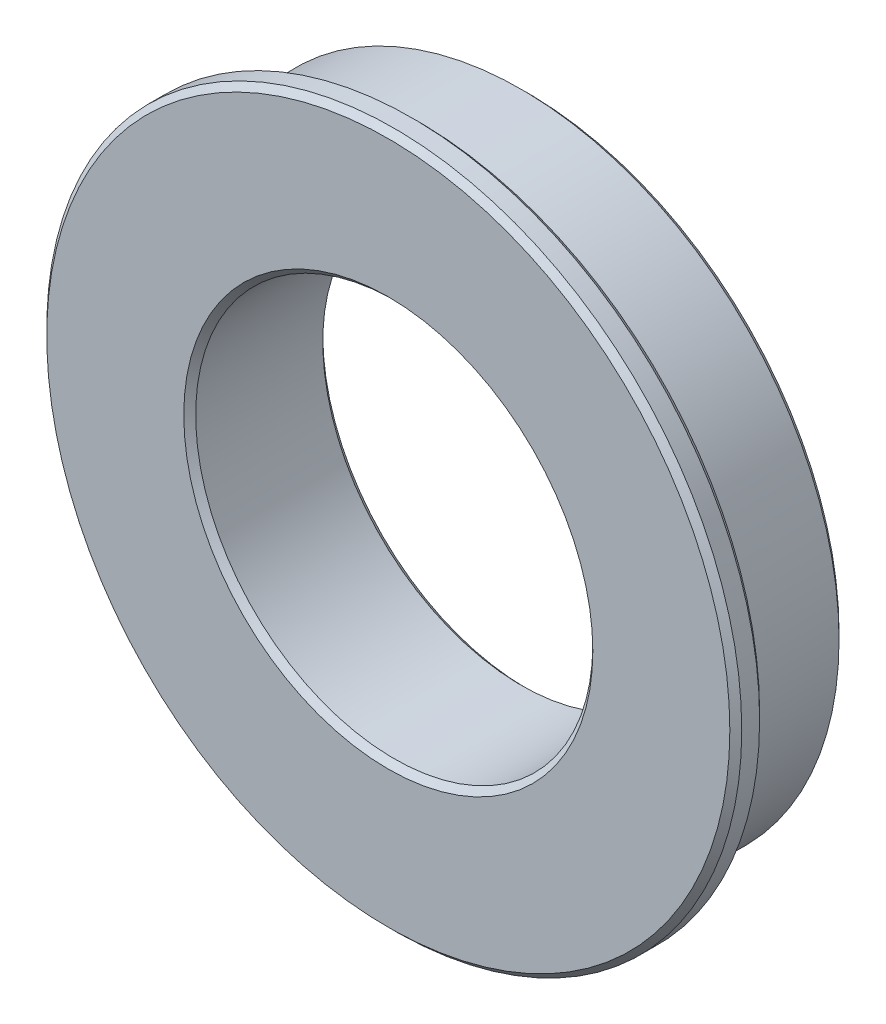
ISO-10303-21;
HEADER;
FILE_DESCRIPTION(('STEP AP214'),'2;1');
FILE_NAME('part.step','',(''),(''),'','','');
FILE_SCHEMA(('AUTOMOTIVE_DESIGN { 1 0 10303 214 1 1 1 1 }'));
ENDSEC;
DATA;
#1=APPLICATION_CONTEXT('core data for automotive mechanical design processes');
#2=APPLICATION_PROTOCOL_DEFINITION('international standard','automotive_design',2000,#1);
#3=PRODUCT_CONTEXT('',#1,'mechanical');
#4=PRODUCT('Part','Part','',(#3));
#5=PRODUCT_RELATED_PRODUCT_CATEGORY('part','',(#4));
#6=PRODUCT_DEFINITION_FORMATION('','',#4);
#7=PRODUCT_DEFINITION_CONTEXT('part definition',#1,'design');
#8=PRODUCT_DEFINITION('design','',#6,#7);
#9=PRODUCT_DEFINITION_SHAPE('','',#8);
#10=(LENGTH_UNIT() NAMED_UNIT(*) SI_UNIT(.MILLI.,.METRE.));
#11=(NAMED_UNIT(*) PLANE_ANGLE_UNIT() SI_UNIT($,.RADIAN.));
#12=(NAMED_UNIT(*) SI_UNIT($,.STERADIAN.) SOLID_ANGLE_UNIT());
#13=UNCERTAINTY_MEASURE_WITH_UNIT(LENGTH_MEASURE(1.E-05),#10,'distance_accuracy_value','');
#14=(GEOMETRIC_REPRESENTATION_CONTEXT(3) GLOBAL_UNCERTAINTY_ASSIGNED_CONTEXT((#13)) GLOBAL_UNIT_ASSIGNED_CONTEXT((#10,
#11,#12)) REPRESENTATION_CONTEXT('',''));
#15=CARTESIAN_POINT('',(0.,0.,0.));
#16=DIRECTION('',(0.,0.,1.));
#17=DIRECTION('',(1.,0.,0.));
#18=AXIS2_PLACEMENT_3D('',#15,#16,#17);
#19=CARTESIAN_POINT('',(0.,0.,3.5));
#20=DIRECTION('',(0.,0.,-1.));
#21=DIRECTION('',(-1.,0.,0.));
#22=AXIS2_PLACEMENT_3D('',#19,#20,#21);
#23=CYLINDRICAL_SURFACE('',#22,16.);
#24=CARTESIAN_POINT('',(0.,0.,-3.2));
#25=DIRECTION('',(0.,0.,1.));
#26=DIRECTION('',(1.,0.,0.));
#27=AXIS2_PLACEMENT_3D('',#24,#25,#26);
#28=CIRCLE('',#27,16.);
#29=CARTESIAN_POINT('',(16.,0.,-3.2));
#30=VERTEX_POINT('',#29);
#31=EDGE_CURVE('E10',#30,#30,#28,.T.);
#32=ORIENTED_EDGE('',*,*,#31,.T.);
#33=EDGE_LOOP('',(#32));
#34=FACE_BOUND('',#33,.T.);
#35=CARTESIAN_POINT('',(0.,0.,2.));
#36=DIRECTION('',(0.,0.,1.));
#37=DIRECTION('',(1.,0.,0.));
#38=AXIS2_PLACEMENT_3D('',#35,#36,#37);
#39=CIRCLE('',#38,16.);
#40=CARTESIAN_POINT('',(16.,0.,2.));
#41=VERTEX_POINT('',#40);
#42=EDGE_CURVE('E72',#41,#41,#39,.T.);
#43=ORIENTED_EDGE('',*,*,#42,.F.);
#44=EDGE_LOOP('',(#43));
#45=FACE_BOUND('',#44,.T.);
#46=ADVANCED_FACE('F33',(#34,#45),#23,.T.);
#47=CARTESIAN_POINT('',(0.,0.,3.5));
#48=DIRECTION('',(0.,0.,1.));
#49=DIRECTION('',(1.,0.,0.));
#50=AXIS2_PLACEMENT_3D('',#47,#48,#49);
#51=PLANE('',#50);
#52=CARTESIAN_POINT('',(0.,0.,3.5));
#53=DIRECTION('',(0.,0.,1.));
#54=DIRECTION('',(1.,0.,0.));
#55=AXIS2_PLACEMENT_3D('',#52,#53,#54);
#56=CIRCLE('',#55,10.3);
#57=CARTESIAN_POINT('',(10.3,0.,3.5));
#58=VERTEX_POINT('',#57);
#59=EDGE_CURVE('E60',#58,#58,#56,.F.);
#60=ORIENTED_EDGE('',*,*,#59,.T.);
#61=EDGE_LOOP('',(#60));
#62=FACE_BOUND('',#61,.T.);
#63=CARTESIAN_POINT('',(0.,0.,3.5));
#64=DIRECTION('',(0.,0.,1.));
#65=DIRECTION('',(1.,0.,0.));
#66=AXIS2_PLACEMENT_3D('',#63,#64,#65);
#67=CIRCLE('',#66,17.2);
#68=CARTESIAN_POINT('',(17.2,0.,3.5));
#69=VERTEX_POINT('',#68);
#70=EDGE_CURVE('E63',#69,#69,#67,.T.);
#71=ORIENTED_EDGE('',*,*,#70,.T.);
#72=EDGE_LOOP('',(#71));
#73=FACE_BOUND('',#72,.T.);
#74=ADVANCED_FACE('F79',(#62,#73),#51,.T.);
#75=CARTESIAN_POINT('',(0.,0.,-3.5));
#76=DIRECTION('',(0.,0.,1.));
#77=DIRECTION('',(1.,0.,0.));
#78=AXIS2_PLACEMENT_3D('',#75,#76,#77);
#79=PLANE('',#78);
#80=CARTESIAN_POINT('',(0.,0.,-3.5));
#81=DIRECTION('',(0.,0.,1.));
#82=DIRECTION('',(1.,0.,0.));
#83=AXIS2_PLACEMENT_3D('',#80,#81,#82);
#84=CIRCLE('',#83,10.3);
#85=CARTESIAN_POINT('',(10.3,0.,-3.5));
#86=VERTEX_POINT('',#85);
#87=EDGE_CURVE('E41',#86,#86,#84,.T.);
#88=ORIENTED_EDGE('',*,*,#87,.T.);
#89=EDGE_LOOP('',(#88));
#90=FACE_BOUND('',#89,.T.);
#91=CARTESIAN_POINT('',(0.,0.,-3.5));
#92=DIRECTION('',(0.,0.,1.));
#93=DIRECTION('',(1.,0.,0.));
#94=AXIS2_PLACEMENT_3D('',#91,#92,#93);
#95=CIRCLE('',#94,15.7);
#96=CARTESIAN_POINT('',(15.7,0.,-3.5));
#97=VERTEX_POINT('',#96);
#98=EDGE_CURVE('E45',#97,#97,#95,.F.);
#99=ORIENTED_EDGE('',*,*,#98,.T.);
#100=EDGE_LOOP('',(#99));
#101=FACE_BOUND('',#100,.T.);
#102=ADVANCED_FACE('F84',(#90,#101),#79,.F.);
#103=CARTESIAN_POINT('',(0.,0.,3.5));
#104=DIRECTION('',(0.,0.,-1.));
#105=DIRECTION('',(-1.,0.,0.));
#106=AXIS2_PLACEMENT_3D('',#103,#104,#105);
#107=CYLINDRICAL_SURFACE('',#106,10.);
#108=CARTESIAN_POINT('',(0.,0.,3.2));
#109=DIRECTION('',(0.,0.,1.));
#110=DIRECTION('',(1.,0.,0.));
#111=AXIS2_PLACEMENT_3D('',#108,#109,#110);
#112=CIRCLE('',#111,10.);
#113=CARTESIAN_POINT('',(10.,0.,3.2));
#114=VERTEX_POINT('',#113);
#115=EDGE_CURVE('E66',#114,#114,#112,.T.);
#116=ORIENTED_EDGE('',*,*,#115,.T.);
#117=EDGE_LOOP('',(#116));
#118=FACE_BOUND('',#117,.T.);
#119=CARTESIAN_POINT('',(0.,0.,-3.2));
#120=DIRECTION('',(0.,0.,1.));
#121=DIRECTION('',(1.,0.,0.));
#122=AXIS2_PLACEMENT_3D('',#119,#120,#121);
#123=CIRCLE('',#122,10.);
#124=CARTESIAN_POINT('',(10.,0.,-3.2));
#125=VERTEX_POINT('',#124);
#126=EDGE_CURVE('E69',#125,#125,#123,.F.);
#127=ORIENTED_EDGE('',*,*,#126,.T.);
#128=EDGE_LOOP('',(#127));
#129=FACE_BOUND('',#128,.T.);
#130=ADVANCED_FACE('F123',(#118,#129),#107,.F.);
#131=CARTESIAN_POINT('',(0.,0.,2.));
#132=DIRECTION('',(0.,0.,1.));
#133=DIRECTION('',(1.,0.,0.));
#134=AXIS2_PLACEMENT_3D('',#131,#132,#133);
#135=PLANE('',#134);
#136=CARTESIAN_POINT('',(0.,0.,2.));
#137=DIRECTION('',(0.,0.,1.));
#138=DIRECTION('',(1.,0.,0.));
#139=AXIS2_PLACEMENT_3D('',#136,#137,#138);
#140=CIRCLE('',#139,17.2);
#141=CARTESIAN_POINT('',(17.2,0.,2.));
#142=VERTEX_POINT('',#141);
#143=EDGE_CURVE('E49',#142,#142,#140,.F.);
#144=ORIENTED_EDGE('',*,*,#143,.T.);
#145=EDGE_LOOP('',(#144));
#146=FACE_BOUND('',#145,.T.);
#147=ORIENTED_EDGE('',*,*,#42,.T.);
#148=EDGE_LOOP('',(#147));
#149=FACE_BOUND('',#148,.T.);
#150=ADVANCED_FACE('F76',(#146,#149),#135,.F.);
#151=CARTESIAN_POINT('',(0.,0.,2.));
#152=DIRECTION('',(0.,0.,1.));
#153=DIRECTION('',(1.,0.,0.));
#154=AXIS2_PLACEMENT_3D('',#151,#152,#153);
#155=CYLINDRICAL_SURFACE('',#154,17.5);
#156=CARTESIAN_POINT('',(0.,0.,3.2));
#157=DIRECTION('',(0.,0.,1.));
#158=DIRECTION('',(1.,0.,0.));
#159=AXIS2_PLACEMENT_3D('',#156,#157,#158);
#160=CIRCLE('',#159,17.5);
#161=CARTESIAN_POINT('',(17.5,0.,3.2));
#162=VERTEX_POINT('',#161);
#163=EDGE_CURVE('E54',#162,#162,#160,.F.);
#164=ORIENTED_EDGE('',*,*,#163,.T.);
#165=EDGE_LOOP('',(#164));
#166=FACE_BOUND('',#165,.T.);
#167=CARTESIAN_POINT('',(0.,0.,2.3));
#168=DIRECTION('',(0.,0.,1.));
#169=DIRECTION('',(1.,0.,0.));
#170=AXIS2_PLACEMENT_3D('',#167,#168,#169);
#171=CIRCLE('',#170,17.5);
#172=CARTESIAN_POINT('',(17.5,0.,2.3));
#173=VERTEX_POINT('',#172);
#174=EDGE_CURVE('E57',#173,#173,#171,.T.);
#175=ORIENTED_EDGE('',*,*,#174,.T.);
#176=EDGE_LOOP('',(#175));
#177=FACE_BOUND('',#176,.T.);
#178=ADVANCED_FACE('F97',(#166,#177),#155,.T.);
#179=CARTESIAN_POINT('',(0.,0.,3.2));
#180=DIRECTION('',(0.,0.,1.));
#181=DIRECTION('',(1.,0.,0.));
#182=AXIS2_PLACEMENT_3D('',#179,#180,#181);
#183=CONICAL_SURFACE('',#182,10.,0.785398163397448);
#184=ORIENTED_EDGE('',*,*,#59,.F.);
#185=EDGE_LOOP('',(#184));
#186=FACE_BOUND('',#185,.T.);
#187=ORIENTED_EDGE('',*,*,#115,.F.);
#188=EDGE_LOOP('',(#187));
#189=FACE_BOUND('',#188,.T.);
#190=ADVANCED_FACE('F90',(#186,#189),#183,.F.);
#191=CARTESIAN_POINT('',(0.,0.,3.5));
#192=DIRECTION('',(0.,0.,-1.));
#193=DIRECTION('',(-1.,0.,0.));
#194=AXIS2_PLACEMENT_3D('',#191,#192,#193);
#195=CONICAL_SURFACE('',#194,17.2,0.785398163397443);
#196=ORIENTED_EDGE('',*,*,#163,.F.);
#197=EDGE_LOOP('',(#196));
#198=FACE_BOUND('',#197,.T.);
#199=ORIENTED_EDGE('',*,*,#70,.F.);
#200=EDGE_LOOP('',(#199));
#201=FACE_BOUND('',#200,.T.);
#202=ADVANCED_FACE('F96',(#198,#201),#195,.T.);
#203=CARTESIAN_POINT('',(0.,0.,2.3));
#204=DIRECTION('',(0.,0.,1.));
#205=DIRECTION('',(1.,0.,0.));
#206=AXIS2_PLACEMENT_3D('',#203,#204,#205);
#207=CONICAL_SURFACE('',#206,17.5,0.785398163397454);
#208=ORIENTED_EDGE('',*,*,#143,.F.);
#209=EDGE_LOOP('',(#208));
#210=FACE_BOUND('',#209,.T.);
#211=ORIENTED_EDGE('',*,*,#174,.F.);
#212=EDGE_LOOP('',(#211));
#213=FACE_BOUND('',#212,.T.);
#214=ADVANCED_FACE('F104',(#210,#213),#207,.T.);
#215=CARTESIAN_POINT('',(0.,0.,-3.5));
#216=DIRECTION('',(0.,0.,-1.));
#217=DIRECTION('',(-1.,0.,0.));
#218=AXIS2_PLACEMENT_3D('',#215,#216,#217);
#219=CONICAL_SURFACE('',#218,10.3,0.785398163397446);
#220=ORIENTED_EDGE('',*,*,#126,.F.);
#221=EDGE_LOOP('',(#220));
#222=FACE_BOUND('',#221,.T.);
#223=ORIENTED_EDGE('',*,*,#87,.F.);
#224=EDGE_LOOP('',(#223));
#225=FACE_BOUND('',#224,.T.);
#226=ADVANCED_FACE('F110',(#222,#225),#219,.F.);
#227=CARTESIAN_POINT('',(0.,0.,-3.2));
#228=DIRECTION('',(0.,0.,1.));
#229=DIRECTION('',(1.,0.,0.));
#230=AXIS2_PLACEMENT_3D('',#227,#228,#229);
#231=CONICAL_SURFACE('',#230,16.,0.785398163397454);
#232=ORIENTED_EDGE('',*,*,#98,.F.);
#233=EDGE_LOOP('',(#232));
#234=FACE_BOUND('',#233,.T.);
#235=ORIENTED_EDGE('',*,*,#31,.F.);
#236=EDGE_LOOP('',(#235));
#237=FACE_BOUND('',#236,.T.);
#238=ADVANCED_FACE('F36',(#234,#237),#231,.T.);
#239=CLOSED_SHELL('',(#46,#74,#102,#130,#150,#178,#190,#202,#214,#226,#238));
#240=MANIFOLD_SOLID_BREP('B2',#239);
#241=ADVANCED_BREP_SHAPE_REPRESENTATION('',(#18,#240),#14);
#242=SHAPE_DEFINITION_REPRESENTATION(#9,#241);
ENDSEC;
END-ISO-10303-21;
